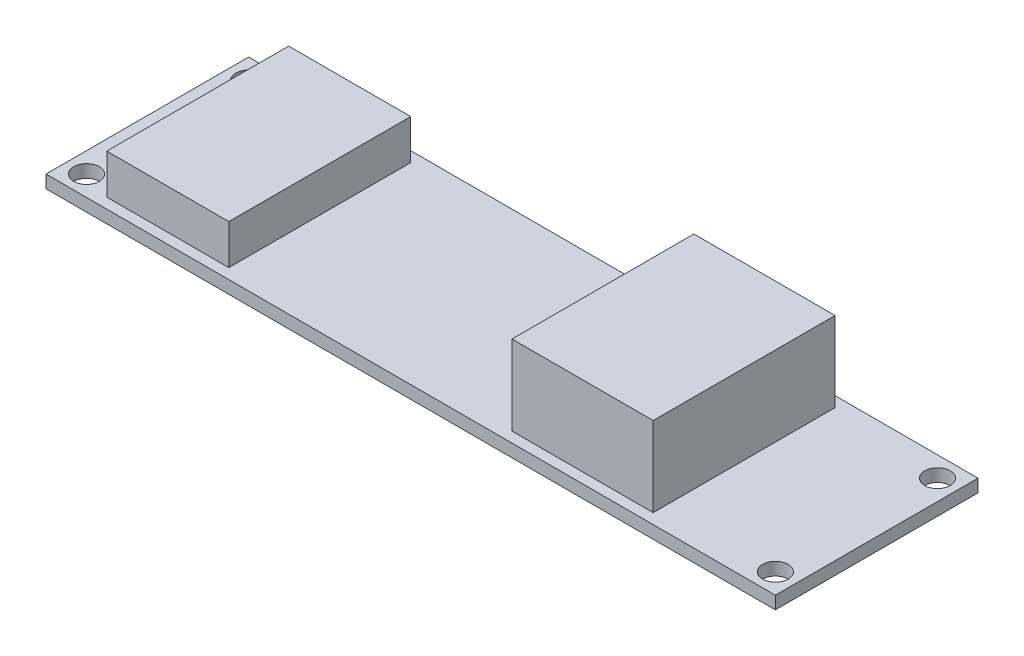
ISO-10303-21;
HEADER;
FILE_DESCRIPTION(('STEP AP214'),'2;1');
FILE_NAME('part.step','',(''),(''),'','','');
FILE_SCHEMA(('AUTOMOTIVE_DESIGN { 1 0 10303 214 1 1 1 1 }'));
ENDSEC;
DATA;
#1=APPLICATION_CONTEXT('core data for automotive mechanical design processes');
#2=APPLICATION_PROTOCOL_DEFINITION('international standard','automotive_design',2000,#1);
#3=PRODUCT_CONTEXT('',#1,'mechanical');
#4=PRODUCT('Part','Part','',(#3));
#5=PRODUCT_RELATED_PRODUCT_CATEGORY('part','',(#4));
#6=PRODUCT_DEFINITION_FORMATION('','',#4);
#7=PRODUCT_DEFINITION_CONTEXT('part definition',#1,'design');
#8=PRODUCT_DEFINITION('design','',#6,#7);
#9=PRODUCT_DEFINITION_SHAPE('','',#8);
#10=(LENGTH_UNIT() NAMED_UNIT(*) SI_UNIT(.MILLI.,.METRE.));
#11=(NAMED_UNIT(*) PLANE_ANGLE_UNIT() SI_UNIT($,.RADIAN.));
#12=(NAMED_UNIT(*) SI_UNIT($,.STERADIAN.) SOLID_ANGLE_UNIT());
#13=UNCERTAINTY_MEASURE_WITH_UNIT(LENGTH_MEASURE(1.E-05),#10,'distance_accuracy_value','');
#14=(GEOMETRIC_REPRESENTATION_CONTEXT(3) GLOBAL_UNCERTAINTY_ASSIGNED_CONTEXT((#13)) GLOBAL_UNIT_ASSIGNED_CONTEXT((#10,
#11,#12)) REPRESENTATION_CONTEXT('',''));
#15=CARTESIAN_POINT('',(0.,0.,0.));
#16=DIRECTION('',(0.,0.,1.));
#17=DIRECTION('',(1.,0.,0.));
#18=AXIS2_PLACEMENT_3D('',#15,#16,#17);
#19=CARTESIAN_POINT('',(0.,1.6,0.));
#20=DIRECTION('',(0.,1.,0.));
#21=DIRECTION('',(0.,0.,1.));
#22=AXIS2_PLACEMENT_3D('',#19,#20,#21);
#23=PLANE('',#22);
#24=CARTESIAN_POINT('',(43.18,1.6,10.16));
#25=DIRECTION('',(0.,1.,0.));
#26=DIRECTION('',(0.,0.,1.));
#27=AXIS2_PLACEMENT_3D('',#24,#25,#26);
#28=CIRCLE('',#27,1.6);
#29=CARTESIAN_POINT('',(43.18,1.6,11.76));
#30=VERTEX_POINT('',#29);
#31=EDGE_CURVE('E187',#30,#30,#28,.T.);
#32=ORIENTED_EDGE('',*,*,#31,.F.);
#33=EDGE_LOOP('',(#32));
#34=FACE_BOUND('',#33,.T.);
#35=CARTESIAN_POINT('',(-43.18,1.6,-10.16));
#36=DIRECTION('',(0.,1.,0.));
#37=DIRECTION('',(0.,0.,1.));
#38=AXIS2_PLACEMENT_3D('',#35,#36,#37);
#39=CIRCLE('',#38,1.6);
#40=CARTESIAN_POINT('',(-43.18,1.6,-8.56));
#41=VERTEX_POINT('',#40);
#42=EDGE_CURVE('E199',#41,#41,#39,.T.);
#43=ORIENTED_EDGE('',*,*,#42,.F.);
#44=EDGE_LOOP('',(#43));
#45=FACE_BOUND('',#44,.T.);
#46=DIRECTION('',(0.,0.,-1.));
#47=VECTOR('',#46,1.);
#48=CARTESIAN_POINT('',(45.72,1.6,-12.7));
#49=LINE('',#48,#47);
#50=CARTESIAN_POINT('',(45.72,1.6,12.7));
#51=VERTEX_POINT('',#50);
#52=CARTESIAN_POINT('',(45.72,1.6,-12.7));
#53=VERTEX_POINT('',#52);
#54=EDGE_CURVE('E205',#51,#53,#49,.T.);
#55=ORIENTED_EDGE('',*,*,#54,.T.);
#56=DIRECTION('',(-1.,0.,0.));
#57=VECTOR('',#56,1.);
#58=CARTESIAN_POINT('',(-45.72,1.6,-12.7));
#59=LINE('',#58,#57);
#60=CARTESIAN_POINT('',(-45.72,1.6,-12.7));
#61=VERTEX_POINT('',#60);
#62=EDGE_CURVE('E208',#53,#61,#59,.T.);
#63=ORIENTED_EDGE('',*,*,#62,.T.);
#64=DIRECTION('',(0.,0.,1.));
#65=VECTOR('',#64,1.);
#66=CARTESIAN_POINT('',(-45.72,1.6,-12.7));
#67=LINE('',#66,#65);
#68=CARTESIAN_POINT('',(-45.72,1.6,12.7));
#69=VERTEX_POINT('',#68);
#70=EDGE_CURVE('E211',#61,#69,#67,.T.);
#71=ORIENTED_EDGE('',*,*,#70,.T.);
#72=DIRECTION('',(1.,0.,0.));
#73=VECTOR('',#72,1.);
#74=CARTESIAN_POINT('',(-45.72,1.6,12.7));
#75=LINE('',#74,#73);
#76=EDGE_CURVE('E213',#69,#51,#75,.T.);
#77=ORIENTED_EDGE('',*,*,#76,.T.);
#78=EDGE_LOOP('',(#55,#63,#71,#77));
#79=FACE_BOUND('',#78,.T.);
#80=CARTESIAN_POINT('',(43.18,1.6,-10.16));
#81=DIRECTION('',(0.,1.,0.));
#82=DIRECTION('',(0.,0.,-1.));
#83=AXIS2_PLACEMENT_3D('',#80,#81,#82);
#84=CIRCLE('',#83,1.6);
#85=CARTESIAN_POINT('',(43.18,1.6,-11.76));
#86=VERTEX_POINT('',#85);
#87=EDGE_CURVE('E193',#86,#86,#84,.T.);
#88=ORIENTED_EDGE('',*,*,#87,.F.);
#89=EDGE_LOOP('',(#88));
#90=FACE_BOUND('',#89,.T.);
#91=CARTESIAN_POINT('',(-43.18,1.6,10.16));
#92=DIRECTION('',(0.,1.,0.));
#93=DIRECTION('',(0.,0.,-1.));
#94=AXIS2_PLACEMENT_3D('',#91,#92,#93);
#95=CIRCLE('',#94,1.6);
#96=CARTESIAN_POINT('',(-43.18,1.6,8.56));
#97=VERTEX_POINT('',#96);
#98=EDGE_CURVE('E181',#97,#97,#95,.T.);
#99=ORIENTED_EDGE('',*,*,#98,.F.);
#100=EDGE_LOOP('',(#99));
#101=FACE_BOUND('',#100,.T.);
#102=DIRECTION('',(1.,0.,0.));
#103=VECTOR('',#102,1.);
#104=CARTESIAN_POINT('',(-39.4,1.6,11.4));
#105=LINE('',#104,#103);
#106=CARTESIAN_POINT('',(-39.4,1.6,11.4));
#107=VERTEX_POINT('',#106);
#108=CARTESIAN_POINT('',(-24.1,1.6,11.4));
#109=VERTEX_POINT('',#108);
#110=EDGE_CURVE('E152',#107,#109,#105,.T.);
#111=ORIENTED_EDGE('',*,*,#110,.F.);
#112=DIRECTION('',(0.,0.,1.));
#113=VECTOR('',#112,1.);
#114=CARTESIAN_POINT('',(-39.4,1.6,-11.4));
#115=LINE('',#114,#113);
#116=CARTESIAN_POINT('',(-39.4,1.6,-11.4));
#117=VERTEX_POINT('',#116);
#118=EDGE_CURVE('E149',#117,#107,#115,.T.);
#119=ORIENTED_EDGE('',*,*,#118,.F.);
#120=DIRECTION('',(-1.,0.,0.));
#121=VECTOR('',#120,1.);
#122=CARTESIAN_POINT('',(-39.4,1.6,-11.4));
#123=LINE('',#122,#121);
#124=CARTESIAN_POINT('',(-24.1,1.6,-11.4));
#125=VERTEX_POINT('',#124);
#126=EDGE_CURVE('E161',#125,#117,#123,.T.);
#127=ORIENTED_EDGE('',*,*,#126,.F.);
#128=DIRECTION('',(0.,0.,-1.));
#129=VECTOR('',#128,1.);
#130=CARTESIAN_POINT('',(-24.1,1.6,-11.4));
#131=LINE('',#130,#129);
#132=EDGE_CURVE('E169',#109,#125,#131,.T.);
#133=ORIENTED_EDGE('',*,*,#132,.F.);
#134=EDGE_LOOP('',(#111,#119,#127,#133));
#135=FACE_BOUND('',#134,.T.);
#136=DIRECTION('',(1.,0.,0.));
#137=VECTOR('',#136,1.);
#138=CARTESIAN_POINT('',(11.4,1.6,11.4));
#139=LINE('',#138,#137);
#140=CARTESIAN_POINT('',(11.4,1.6,11.4));
#141=VERTEX_POINT('',#140);
#142=CARTESIAN_POINT('',(29.1,1.6,11.4));
#143=VERTEX_POINT('',#142);
#144=EDGE_CURVE('E448',#141,#143,#139,.T.);
#145=ORIENTED_EDGE('',*,*,#144,.F.);
#146=DIRECTION('',(0.,0.,1.));
#147=VECTOR('',#146,1.);
#148=CARTESIAN_POINT('',(11.4,1.6,-11.4));
#149=LINE('',#148,#147);
#150=CARTESIAN_POINT('',(11.4,1.6,-11.4));
#151=VERTEX_POINT('',#150);
#152=EDGE_CURVE('E147',#151,#141,#149,.T.);
#153=ORIENTED_EDGE('',*,*,#152,.F.);
#154=DIRECTION('',(-1.,0.,0.));
#155=VECTOR('',#154,1.);
#156=CARTESIAN_POINT('',(11.4,1.6,-11.4));
#157=LINE('',#156,#155);
#158=CARTESIAN_POINT('',(29.1,1.6,-11.4));
#159=VERTEX_POINT('',#158);
#160=EDGE_CURVE('E143',#159,#151,#157,.T.);
#161=ORIENTED_EDGE('',*,*,#160,.F.);
#162=DIRECTION('',(0.,0.,-1.));
#163=VECTOR('',#162,1.);
#164=CARTESIAN_POINT('',(29.1,1.6,-11.4));
#165=LINE('',#164,#163);
#166=EDGE_CURVE('E445',#143,#159,#165,.T.);
#167=ORIENTED_EDGE('',*,*,#166,.F.);
#168=EDGE_LOOP('',(#145,#153,#161,#167));
#169=FACE_BOUND('',#168,.T.);
#170=ADVANCED_FACE('F34',(#34,#45,#79,#90,#101,#135,#169),#23,.T.);
#171=CARTESIAN_POINT('',(0.,0.,0.));
#172=DIRECTION('',(0.,1.,0.));
#173=DIRECTION('',(0.,0.,1.));
#174=AXIS2_PLACEMENT_3D('',#171,#172,#173);
#175=PLANE('',#174);
#176=DIRECTION('',(0.,0.,-1.));
#177=VECTOR('',#176,1.);
#178=CARTESIAN_POINT('',(45.72,0.,-12.7));
#179=LINE('',#178,#177);
#180=CARTESIAN_POINT('',(45.72,0.,12.7));
#181=VERTEX_POINT('',#180);
#182=CARTESIAN_POINT('',(45.72,0.,-12.7));
#183=VERTEX_POINT('',#182);
#184=EDGE_CURVE('E202',#181,#183,#179,.T.);
#185=ORIENTED_EDGE('',*,*,#184,.F.);
#186=DIRECTION('',(1.,0.,0.));
#187=VECTOR('',#186,1.);
#188=CARTESIAN_POINT('',(-45.72,0.,12.7));
#189=LINE('',#188,#187);
#190=CARTESIAN_POINT('',(-45.72,0.,12.7));
#191=VERTEX_POINT('',#190);
#192=EDGE_CURVE('E209',#191,#181,#189,.T.);
#193=ORIENTED_EDGE('',*,*,#192,.F.);
#194=DIRECTION('',(0.,0.,1.));
#195=VECTOR('',#194,1.);
#196=CARTESIAN_POINT('',(-45.72,0.,-12.7));
#197=LINE('',#196,#195);
#198=CARTESIAN_POINT('',(-45.72,0.,-12.7));
#199=VERTEX_POINT('',#198);
#200=EDGE_CURVE('E220',#199,#191,#197,.T.);
#201=ORIENTED_EDGE('',*,*,#200,.F.);
#202=DIRECTION('',(-1.,0.,0.));
#203=VECTOR('',#202,1.);
#204=CARTESIAN_POINT('',(-45.72,0.,-12.7));
#205=LINE('',#204,#203);
#206=EDGE_CURVE('E218',#183,#199,#205,.T.);
#207=ORIENTED_EDGE('',*,*,#206,.F.);
#208=EDGE_LOOP('',(#185,#193,#201,#207));
#209=FACE_BOUND('',#208,.T.);
#210=CARTESIAN_POINT('',(-43.18,0.,-10.16));
#211=DIRECTION('',(0.,1.,0.));
#212=DIRECTION('',(0.,0.,1.));
#213=AXIS2_PLACEMENT_3D('',#210,#211,#212);
#214=CIRCLE('',#213,1.6);
#215=CARTESIAN_POINT('',(-43.18,0.,-8.56));
#216=VERTEX_POINT('',#215);
#217=EDGE_CURVE('E196',#216,#216,#214,.T.);
#218=ORIENTED_EDGE('',*,*,#217,.T.);
#219=EDGE_LOOP('',(#218));
#220=FACE_BOUND('',#219,.T.);
#221=CARTESIAN_POINT('',(43.18,0.,-10.16));
#222=DIRECTION('',(0.,1.,0.));
#223=DIRECTION('',(0.,0.,-1.));
#224=AXIS2_PLACEMENT_3D('',#221,#222,#223);
#225=CIRCLE('',#224,1.6);
#226=CARTESIAN_POINT('',(43.18,0.,-11.76));
#227=VERTEX_POINT('',#226);
#228=EDGE_CURVE('E190',#227,#227,#225,.T.);
#229=ORIENTED_EDGE('',*,*,#228,.T.);
#230=EDGE_LOOP('',(#229));
#231=FACE_BOUND('',#230,.T.);
#232=CARTESIAN_POINT('',(43.18,0.,10.16));
#233=DIRECTION('',(0.,1.,0.));
#234=DIRECTION('',(0.,0.,1.));
#235=AXIS2_PLACEMENT_3D('',#232,#233,#234);
#236=CIRCLE('',#235,1.6);
#237=CARTESIAN_POINT('',(43.18,0.,11.76));
#238=VERTEX_POINT('',#237);
#239=EDGE_CURVE('E184',#238,#238,#236,.T.);
#240=ORIENTED_EDGE('',*,*,#239,.T.);
#241=EDGE_LOOP('',(#240));
#242=FACE_BOUND('',#241,.T.);
#243=CARTESIAN_POINT('',(-43.18,0.,10.16));
#244=DIRECTION('',(0.,1.,0.));
#245=DIRECTION('',(0.,0.,-1.));
#246=AXIS2_PLACEMENT_3D('',#243,#244,#245);
#247=CIRCLE('',#246,1.6);
#248=CARTESIAN_POINT('',(-43.18,0.,8.56));
#249=VERTEX_POINT('',#248);
#250=EDGE_CURVE('E180',#249,#249,#247,.T.);
#251=ORIENTED_EDGE('',*,*,#250,.T.);
#252=EDGE_LOOP('',(#251));
#253=FACE_BOUND('',#252,.T.);
#254=ADVANCED_FACE('F238',(#209,#220,#231,#242,#253),#175,.F.);
#255=CARTESIAN_POINT('',(45.72,1.6,-12.7));
#256=DIRECTION('',(-1.,0.,0.));
#257=DIRECTION('',(0.,0.,1.));
#258=AXIS2_PLACEMENT_3D('',#255,#256,#257);
#259=PLANE('',#258);
#260=ORIENTED_EDGE('',*,*,#184,.T.);
#261=DIRECTION('',(0.,-1.,0.));
#262=VECTOR('',#261,1.);
#263=CARTESIAN_POINT('',(45.72,1.6,-12.7));
#264=LINE('',#263,#262);
#265=EDGE_CURVE('E11',#53,#183,#264,.T.);
#266=ORIENTED_EDGE('',*,*,#265,.F.);
#267=ORIENTED_EDGE('',*,*,#54,.F.);
#268=DIRECTION('',(0.,-1.,0.));
#269=VECTOR('',#268,1.);
#270=CARTESIAN_POINT('',(45.72,1.6,12.7));
#271=LINE('',#270,#269);
#272=EDGE_CURVE('E215',#51,#181,#271,.T.);
#273=ORIENTED_EDGE('',*,*,#272,.T.);
#274=EDGE_LOOP('',(#260,#266,#267,#273));
#275=FACE_BOUND('',#274,.T.);
#276=ADVANCED_FACE('F36',(#275),#259,.F.);
#277=CARTESIAN_POINT('',(-45.72,1.6,-12.7));
#278=DIRECTION('',(0.,0.,1.));
#279=DIRECTION('',(1.,0.,0.));
#280=AXIS2_PLACEMENT_3D('',#277,#278,#279);
#281=PLANE('',#280);
#282=ORIENTED_EDGE('',*,*,#206,.T.);
#283=DIRECTION('',(0.,-1.,0.));
#284=VECTOR('',#283,1.);
#285=CARTESIAN_POINT('',(-45.72,1.6,-12.7));
#286=LINE('',#285,#284);
#287=EDGE_CURVE('E42',#61,#199,#286,.T.);
#288=ORIENTED_EDGE('',*,*,#287,.F.);
#289=ORIENTED_EDGE('',*,*,#62,.F.);
#290=ORIENTED_EDGE('',*,*,#265,.T.);
#291=EDGE_LOOP('',(#282,#288,#289,#290));
#292=FACE_BOUND('',#291,.T.);
#293=ADVANCED_FACE('F249',(#292),#281,.F.);
#294=CARTESIAN_POINT('',(-45.72,1.6,-12.7));
#295=DIRECTION('',(1.,0.,0.));
#296=DIRECTION('',(0.,0.,-1.));
#297=AXIS2_PLACEMENT_3D('',#294,#295,#296);
#298=PLANE('',#297);
#299=ORIENTED_EDGE('',*,*,#200,.T.);
#300=DIRECTION('',(0.,-1.,0.));
#301=VECTOR('',#300,1.);
#302=CARTESIAN_POINT('',(-45.72,1.6,12.7));
#303=LINE('',#302,#301);
#304=EDGE_CURVE('E225',#69,#191,#303,.T.);
#305=ORIENTED_EDGE('',*,*,#304,.F.);
#306=ORIENTED_EDGE('',*,*,#70,.F.);
#307=ORIENTED_EDGE('',*,*,#287,.T.);
#308=EDGE_LOOP('',(#299,#305,#306,#307));
#309=FACE_BOUND('',#308,.T.);
#310=ADVANCED_FACE('F232',(#309),#298,.F.);
#311=CARTESIAN_POINT('',(-45.72,1.6,12.7));
#312=DIRECTION('',(0.,0.,-1.));
#313=DIRECTION('',(-1.,0.,0.));
#314=AXIS2_PLACEMENT_3D('',#311,#312,#313);
#315=PLANE('',#314);
#316=ORIENTED_EDGE('',*,*,#192,.T.);
#317=ORIENTED_EDGE('',*,*,#272,.F.);
#318=ORIENTED_EDGE('',*,*,#76,.F.);
#319=ORIENTED_EDGE('',*,*,#304,.T.);
#320=EDGE_LOOP('',(#316,#317,#318,#319));
#321=FACE_BOUND('',#320,.T.);
#322=ADVANCED_FACE('F242',(#321),#315,.F.);
#323=CARTESIAN_POINT('',(-43.18,1.6,-10.16));
#324=DIRECTION('',(0.,-1.,0.));
#325=DIRECTION('',(0.,0.,-1.));
#326=AXIS2_PLACEMENT_3D('',#323,#324,#325);
#327=CYLINDRICAL_SURFACE('',#326,1.6);
#328=ORIENTED_EDGE('',*,*,#42,.T.);
#329=EDGE_LOOP('',(#328));
#330=FACE_BOUND('',#329,.T.);
#331=ORIENTED_EDGE('',*,*,#217,.F.);
#332=EDGE_LOOP('',(#331));
#333=FACE_BOUND('',#332,.T.);
#334=ADVANCED_FACE('F268',(#330,#333),#327,.F.);
#335=CARTESIAN_POINT('',(43.18,1.6,-10.16));
#336=DIRECTION('',(0.,-1.,0.));
#337=DIRECTION('',(0.,0.,-1.));
#338=AXIS2_PLACEMENT_3D('',#335,#336,#337);
#339=CYLINDRICAL_SURFACE('',#338,1.6);
#340=ORIENTED_EDGE('',*,*,#87,.T.);
#341=EDGE_LOOP('',(#340));
#342=FACE_BOUND('',#341,.T.);
#343=ORIENTED_EDGE('',*,*,#228,.F.);
#344=EDGE_LOOP('',(#343));
#345=FACE_BOUND('',#344,.T.);
#346=ADVANCED_FACE('F275',(#342,#345),#339,.F.);
#347=CARTESIAN_POINT('',(43.18,1.6,10.16));
#348=DIRECTION('',(0.,-1.,0.));
#349=DIRECTION('',(0.,0.,-1.));
#350=AXIS2_PLACEMENT_3D('',#347,#348,#349);
#351=CYLINDRICAL_SURFACE('',#350,1.6);
#352=ORIENTED_EDGE('',*,*,#31,.T.);
#353=EDGE_LOOP('',(#352));
#354=FACE_BOUND('',#353,.T.);
#355=ORIENTED_EDGE('',*,*,#239,.F.);
#356=EDGE_LOOP('',(#355));
#357=FACE_BOUND('',#356,.T.);
#358=ADVANCED_FACE('F280',(#354,#357),#351,.F.);
#359=CARTESIAN_POINT('',(-43.18,1.6,10.16));
#360=DIRECTION('',(0.,-1.,0.));
#361=DIRECTION('',(0.,0.,-1.));
#362=AXIS2_PLACEMENT_3D('',#359,#360,#361);
#363=CYLINDRICAL_SURFACE('',#362,1.6);
#364=ORIENTED_EDGE('',*,*,#98,.T.);
#365=EDGE_LOOP('',(#364));
#366=FACE_BOUND('',#365,.T.);
#367=ORIENTED_EDGE('',*,*,#250,.F.);
#368=EDGE_LOOP('',(#367));
#369=FACE_BOUND('',#368,.T.);
#370=ADVANCED_FACE('F292',(#366,#369),#363,.F.);
#371=CARTESIAN_POINT('',(-39.4,6.6,-11.4));
#372=DIRECTION('',(1.,0.,0.));
#373=DIRECTION('',(0.,0.,-1.));
#374=AXIS2_PLACEMENT_3D('',#371,#372,#373);
#375=PLANE('',#374);
#376=ORIENTED_EDGE('',*,*,#118,.T.);
#377=DIRECTION('',(0.,-1.,0.));
#378=VECTOR('',#377,1.);
#379=CARTESIAN_POINT('',(-39.4,6.6,11.4));
#380=LINE('',#379,#378);
#381=CARTESIAN_POINT('',(-39.4,6.6,11.4));
#382=VERTEX_POINT('',#381);
#383=EDGE_CURVE('E178',#382,#107,#380,.T.);
#384=ORIENTED_EDGE('',*,*,#383,.F.);
#385=DIRECTION('',(0.,0.,1.));
#386=VECTOR('',#385,1.);
#387=CARTESIAN_POINT('',(-39.4,6.6,-11.4));
#388=LINE('',#387,#386);
#389=CARTESIAN_POINT('',(-39.4,6.6,-11.4));
#390=VERTEX_POINT('',#389);
#391=EDGE_CURVE('E157',#390,#382,#388,.T.);
#392=ORIENTED_EDGE('',*,*,#391,.F.);
#393=DIRECTION('',(0.,-1.,0.));
#394=VECTOR('',#393,1.);
#395=CARTESIAN_POINT('',(-39.4,6.6,-11.4));
#396=LINE('',#395,#394);
#397=EDGE_CURVE('E166',#390,#117,#396,.T.);
#398=ORIENTED_EDGE('',*,*,#397,.T.);
#399=EDGE_LOOP('',(#376,#384,#392,#398));
#400=FACE_BOUND('',#399,.T.);
#401=ADVANCED_FACE('F294',(#400),#375,.F.);
#402=CARTESIAN_POINT('',(-39.4,6.6,11.4));
#403=DIRECTION('',(0.,0.,-1.));
#404=DIRECTION('',(-1.,0.,0.));
#405=AXIS2_PLACEMENT_3D('',#402,#403,#404);
#406=PLANE('',#405);
#407=ORIENTED_EDGE('',*,*,#110,.T.);
#408=DIRECTION('',(0.,-1.,0.));
#409=VECTOR('',#408,1.);
#410=CARTESIAN_POINT('',(-24.1,6.6,11.4));
#411=LINE('',#410,#409);
#412=CARTESIAN_POINT('',(-24.1,6.6,11.4));
#413=VERTEX_POINT('',#412);
#414=EDGE_CURVE('E175',#413,#109,#411,.T.);
#415=ORIENTED_EDGE('',*,*,#414,.F.);
#416=DIRECTION('',(1.,0.,0.));
#417=VECTOR('',#416,1.);
#418=CARTESIAN_POINT('',(-39.4,6.6,11.4));
#419=LINE('',#418,#417);
#420=EDGE_CURVE('E160',#382,#413,#419,.T.);
#421=ORIENTED_EDGE('',*,*,#420,.F.);
#422=ORIENTED_EDGE('',*,*,#383,.T.);
#423=EDGE_LOOP('',(#407,#415,#421,#422));
#424=FACE_BOUND('',#423,.T.);
#425=ADVANCED_FACE('F301',(#424),#406,.F.);
#426=CARTESIAN_POINT('',(-24.1,6.6,-11.4));
#427=DIRECTION('',(-1.,0.,0.));
#428=DIRECTION('',(0.,0.,1.));
#429=AXIS2_PLACEMENT_3D('',#426,#427,#428);
#430=PLANE('',#429);
#431=ORIENTED_EDGE('',*,*,#132,.T.);
#432=DIRECTION('',(0.,-1.,0.));
#433=VECTOR('',#432,1.);
#434=CARTESIAN_POINT('',(-24.1,6.6,-11.4));
#435=LINE('',#434,#433);
#436=CARTESIAN_POINT('',(-24.1,6.6,-11.4));
#437=VERTEX_POINT('',#436);
#438=EDGE_CURVE('E57',#437,#125,#435,.T.);
#439=ORIENTED_EDGE('',*,*,#438,.F.);
#440=DIRECTION('',(0.,0.,-1.));
#441=VECTOR('',#440,1.);
#442=CARTESIAN_POINT('',(-24.1,6.6,-11.4));
#443=LINE('',#442,#441);
#444=EDGE_CURVE('E163',#413,#437,#443,.T.);
#445=ORIENTED_EDGE('',*,*,#444,.F.);
#446=ORIENTED_EDGE('',*,*,#414,.T.);
#447=EDGE_LOOP('',(#431,#439,#445,#446));
#448=FACE_BOUND('',#447,.T.);
#449=ADVANCED_FACE('F309',(#448),#430,.F.);
#450=CARTESIAN_POINT('',(-39.4,6.6,-11.4));
#451=DIRECTION('',(0.,0.,1.));
#452=DIRECTION('',(1.,0.,0.));
#453=AXIS2_PLACEMENT_3D('',#450,#451,#452);
#454=PLANE('',#453);
#455=ORIENTED_EDGE('',*,*,#126,.T.);
#456=ORIENTED_EDGE('',*,*,#397,.F.);
#457=DIRECTION('',(-1.,0.,0.));
#458=VECTOR('',#457,1.);
#459=CARTESIAN_POINT('',(-39.4,6.6,-11.4));
#460=LINE('',#459,#458);
#461=EDGE_CURVE('E165',#437,#390,#460,.T.);
#462=ORIENTED_EDGE('',*,*,#461,.F.);
#463=ORIENTED_EDGE('',*,*,#438,.T.);
#464=EDGE_LOOP('',(#455,#456,#462,#463));
#465=FACE_BOUND('',#464,.T.);
#466=ADVANCED_FACE('F313',(#465),#454,.F.);
#467=CARTESIAN_POINT('',(0.,6.6,0.));
#468=DIRECTION('',(0.,1.,0.));
#469=DIRECTION('',(0.,0.,1.));
#470=AXIS2_PLACEMENT_3D('',#467,#468,#469);
#471=PLANE('',#470);
#472=ORIENTED_EDGE('',*,*,#391,.T.);
#473=ORIENTED_EDGE('',*,*,#420,.T.);
#474=ORIENTED_EDGE('',*,*,#444,.T.);
#475=ORIENTED_EDGE('',*,*,#461,.T.);
#476=EDGE_LOOP('',(#472,#473,#474,#475));
#477=FACE_BOUND('',#476,.T.);
#478=ADVANCED_FACE('F317',(#477),#471,.T.);
#479=CARTESIAN_POINT('',(11.4,11.6,-11.4));
#480=DIRECTION('',(1.,0.,0.));
#481=DIRECTION('',(0.,0.,-1.));
#482=AXIS2_PLACEMENT_3D('',#479,#480,#481);
#483=PLANE('',#482);
#484=ORIENTED_EDGE('',*,*,#152,.T.);
#485=DIRECTION('',(0.,-1.,0.));
#486=VECTOR('',#485,1.);
#487=CARTESIAN_POINT('',(11.4,11.6,11.4));
#488=LINE('',#487,#486);
#489=CARTESIAN_POINT('',(11.4,11.6,11.4));
#490=VERTEX_POINT('',#489);
#491=EDGE_CURVE('E128',#490,#141,#488,.T.);
#492=ORIENTED_EDGE('',*,*,#491,.F.);
#493=DIRECTION('',(0.,0.,1.));
#494=VECTOR('',#493,1.);
#495=CARTESIAN_POINT('',(11.4,11.6,-11.4));
#496=LINE('',#495,#494);
#497=CARTESIAN_POINT('',(11.4,11.6,-11.4));
#498=VERTEX_POINT('',#497);
#499=EDGE_CURVE('E135',#498,#490,#496,.T.);
#500=ORIENTED_EDGE('',*,*,#499,.F.);
#501=DIRECTION('',(0.,-1.,0.));
#502=VECTOR('',#501,1.);
#503=CARTESIAN_POINT('',(11.4,11.6,-11.4));
#504=LINE('',#503,#502);
#505=EDGE_CURVE('E442',#498,#151,#504,.T.);
#506=ORIENTED_EDGE('',*,*,#505,.T.);
#507=EDGE_LOOP('',(#484,#492,#500,#506));
#508=FACE_BOUND('',#507,.T.);
#509=ADVANCED_FACE('F145',(#508),#483,.F.);
#510=CARTESIAN_POINT('',(11.4,11.6,11.4));
#511=DIRECTION('',(0.,0.,-1.));
#512=DIRECTION('',(-1.,0.,0.));
#513=AXIS2_PLACEMENT_3D('',#510,#511,#512);
#514=PLANE('',#513);
#515=ORIENTED_EDGE('',*,*,#144,.T.);
#516=DIRECTION('',(0.,-1.,0.));
#517=VECTOR('',#516,1.);
#518=CARTESIAN_POINT('',(29.1,11.6,11.4));
#519=LINE('',#518,#517);
#520=CARTESIAN_POINT('',(29.1,11.6,11.4));
#521=VERTEX_POINT('',#520);
#522=EDGE_CURVE('E131',#521,#143,#519,.T.);
#523=ORIENTED_EDGE('',*,*,#522,.F.);
#524=DIRECTION('',(1.,0.,0.));
#525=VECTOR('',#524,1.);
#526=CARTESIAN_POINT('',(11.4,11.6,11.4));
#527=LINE('',#526,#525);
#528=EDGE_CURVE('E124',#490,#521,#527,.T.);
#529=ORIENTED_EDGE('',*,*,#528,.F.);
#530=ORIENTED_EDGE('',*,*,#491,.T.);
#531=EDGE_LOOP('',(#515,#523,#529,#530));
#532=FACE_BOUND('',#531,.T.);
#533=ADVANCED_FACE('F126',(#532),#514,.F.);
#534=CARTESIAN_POINT('',(29.1,11.6,-11.4));
#535=DIRECTION('',(-1.,0.,0.));
#536=DIRECTION('',(0.,0.,1.));
#537=AXIS2_PLACEMENT_3D('',#534,#535,#536);
#538=PLANE('',#537);
#539=ORIENTED_EDGE('',*,*,#166,.T.);
#540=DIRECTION('',(0.,-1.,0.));
#541=VECTOR('',#540,1.);
#542=CARTESIAN_POINT('',(29.1,11.6,-11.4));
#543=LINE('',#542,#541);
#544=CARTESIAN_POINT('',(29.1,11.6,-11.4));
#545=VERTEX_POINT('',#544);
#546=EDGE_CURVE('E49',#545,#159,#543,.T.);
#547=ORIENTED_EDGE('',*,*,#546,.F.);
#548=DIRECTION('',(0.,0.,-1.));
#549=VECTOR('',#548,1.);
#550=CARTESIAN_POINT('',(29.1,11.6,-11.4));
#551=LINE('',#550,#549);
#552=EDGE_CURVE('E134',#521,#545,#551,.T.);
#553=ORIENTED_EDGE('',*,*,#552,.F.);
#554=ORIENTED_EDGE('',*,*,#522,.T.);
#555=EDGE_LOOP('',(#539,#547,#553,#554));
#556=FACE_BOUND('',#555,.T.);
#557=ADVANCED_FACE('F325',(#556),#538,.F.);
#558=CARTESIAN_POINT('',(11.4,11.6,-11.4));
#559=DIRECTION('',(0.,0.,1.));
#560=DIRECTION('',(1.,0.,0.));
#561=AXIS2_PLACEMENT_3D('',#558,#559,#560);
#562=PLANE('',#561);
#563=ORIENTED_EDGE('',*,*,#160,.T.);
#564=ORIENTED_EDGE('',*,*,#505,.F.);
#565=DIRECTION('',(-1.,0.,0.));
#566=VECTOR('',#565,1.);
#567=CARTESIAN_POINT('',(11.4,11.6,-11.4));
#568=LINE('',#567,#566);
#569=EDGE_CURVE('E139',#545,#498,#568,.T.);
#570=ORIENTED_EDGE('',*,*,#569,.F.);
#571=ORIENTED_EDGE('',*,*,#546,.T.);
#572=EDGE_LOOP('',(#563,#564,#570,#571));
#573=FACE_BOUND('',#572,.T.);
#574=ADVANCED_FACE('F328',(#573),#562,.F.);
#575=CARTESIAN_POINT('',(0.,11.6,0.));
#576=DIRECTION('',(0.,1.,0.));
#577=DIRECTION('',(0.,0.,1.));
#578=AXIS2_PLACEMENT_3D('',#575,#576,#577);
#579=PLANE('',#578);
#580=ORIENTED_EDGE('',*,*,#499,.T.);
#581=ORIENTED_EDGE('',*,*,#528,.T.);
#582=ORIENTED_EDGE('',*,*,#552,.T.);
#583=ORIENTED_EDGE('',*,*,#569,.T.);
#584=EDGE_LOOP('',(#580,#581,#582,#583));
#585=FACE_BOUND('',#584,.T.);
#586=ADVANCED_FACE('F138',(#585),#579,.T.);
#587=CLOSED_SHELL('',(#170,#254,#276,#293,#310,#322,#334,#346,#358,#370,#401,#425,#449,#466,
#478,#509,#533,#557,#574,#586));
#588=MANIFOLD_SOLID_BREP('B2',#587);
#589=ADVANCED_BREP_SHAPE_REPRESENTATION('',(#18,#588),#14);
#590=SHAPE_DEFINITION_REPRESENTATION(#9,#589);
ENDSEC;
END-ISO-10303-21;
